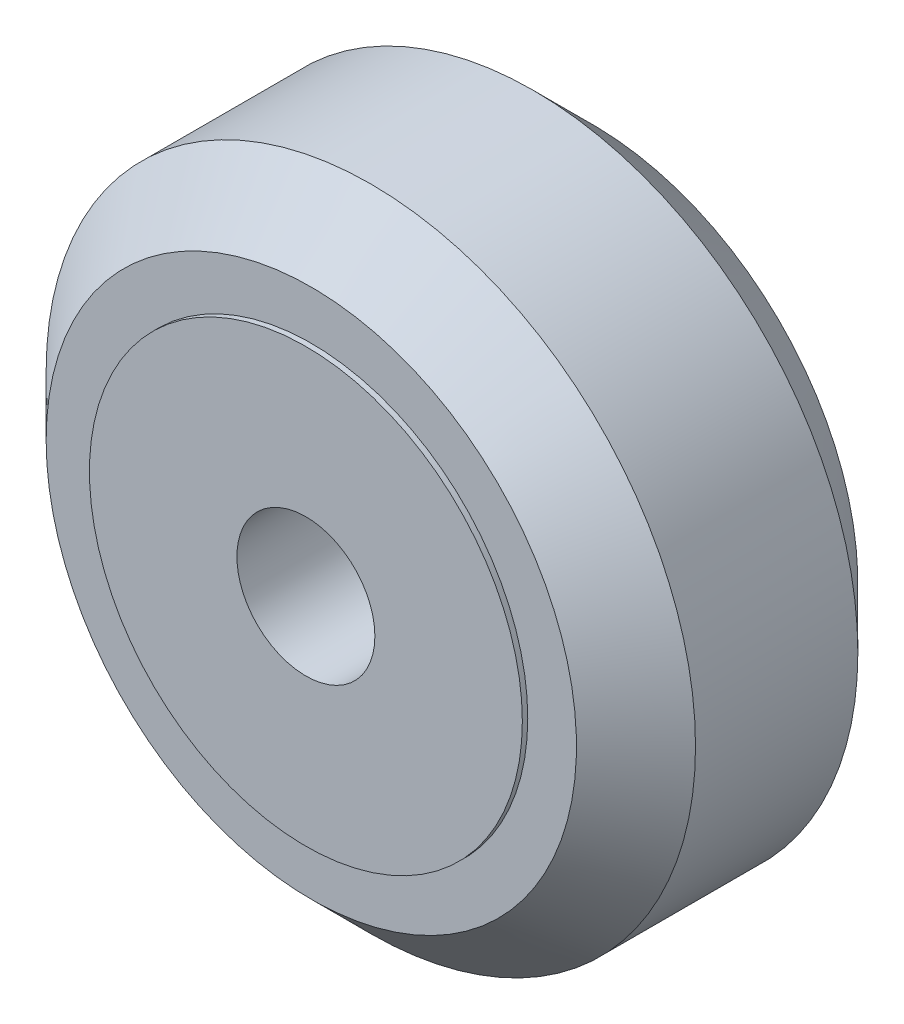
ISO-10303-21;
HEADER;
FILE_DESCRIPTION(('STEP AP214'),'2;1');
FILE_NAME('part.step','',(''),(''),'','','');
FILE_SCHEMA(('AUTOMOTIVE_DESIGN { 1 0 10303 214 1 1 1 1 }'));
ENDSEC;
DATA;
#1=APPLICATION_CONTEXT('core data for automotive mechanical design processes');
#2=APPLICATION_PROTOCOL_DEFINITION('international standard','automotive_design',2000,#1);
#3=PRODUCT_CONTEXT('',#1,'mechanical');
#4=PRODUCT('Part','Part','',(#3));
#5=PRODUCT_RELATED_PRODUCT_CATEGORY('part','',(#4));
#6=PRODUCT_DEFINITION_FORMATION('','',#4);
#7=PRODUCT_DEFINITION_CONTEXT('part definition',#1,'design');
#8=PRODUCT_DEFINITION('design','',#6,#7);
#9=PRODUCT_DEFINITION_SHAPE('','',#8);
#10=(LENGTH_UNIT() NAMED_UNIT(*) SI_UNIT(.MILLI.,.METRE.));
#11=(NAMED_UNIT(*) PLANE_ANGLE_UNIT() SI_UNIT($,.RADIAN.));
#12=(NAMED_UNIT(*) SI_UNIT($,.STERADIAN.) SOLID_ANGLE_UNIT());
#13=UNCERTAINTY_MEASURE_WITH_UNIT(LENGTH_MEASURE(1.E-05),#10,'distance_accuracy_value','');
#14=(GEOMETRIC_REPRESENTATION_CONTEXT(3) GLOBAL_UNCERTAINTY_ASSIGNED_CONTEXT((#13)) GLOBAL_UNIT_ASSIGNED_CONTEXT((#10,
#11,#12)) REPRESENTATION_CONTEXT('',''));
#15=CARTESIAN_POINT('',(0.,0.,0.));
#16=DIRECTION('',(0.,0.,1.));
#17=DIRECTION('',(1.,0.,0.));
#18=AXIS2_PLACEMENT_3D('',#15,#16,#17);
#19=CARTESIAN_POINT('',(0.,8.,11.0451322694377));
#20=DIRECTION('',(0.,0.,1.));
#21=DIRECTION('',(1.,0.,0.));
#22=AXIS2_PLACEMENT_3D('',#19,#20,#21);
#23=PLANE('',#22);
#24=CARTESIAN_POINT('',(0.,0.,11.0451322694377));
#25=DIRECTION('',(0.,0.,-1.));
#26=DIRECTION('',(-1.,0.,0.));
#27=AXIS2_PLACEMENT_3D('',#24,#25,#26);
#28=CIRCLE('',#27,9.80000000000001);
#29=CARTESIAN_POINT('',(-9.80000000000001,0.,11.0451322694377));
#30=VERTEX_POINT('',#29);
#31=EDGE_CURVE('E40',#30,#30,#28,.T.);
#32=ORIENTED_EDGE('',*,*,#31,.F.);
#33=EDGE_LOOP('',(#32));
#34=FACE_BOUND('',#33,.T.);
#35=CARTESIAN_POINT('',(0.,0.,11.0451322694377));
#36=DIRECTION('',(0.,0.,1.));
#37=DIRECTION('',(1.,0.,0.));
#38=AXIS2_PLACEMENT_3D('',#35,#36,#37);
#39=CIRCLE('',#38,8.);
#40=CARTESIAN_POINT('',(8.,0.,11.0451322694377));
#41=VERTEX_POINT('',#40);
#42=EDGE_CURVE('E63',#41,#41,#39,.T.);
#43=ORIENTED_EDGE('',*,*,#42,.F.);
#44=EDGE_LOOP('',(#43));
#45=FACE_BOUND('',#44,.T.);
#46=ADVANCED_FACE('F33',(#34,#45),#23,.T.);
#47=CARTESIAN_POINT('',(0.,9.79999999999999,0.645132269437749));
#48=DIRECTION('',(0.,0.,-1.));
#49=DIRECTION('',(-1.,0.,0.));
#50=AXIS2_PLACEMENT_3D('',#47,#48,#49);
#51=PLANE('',#50);
#52=CARTESIAN_POINT('',(0.,0.,0.645132269437749));
#53=DIRECTION('',(0.,0.,-1.));
#54=DIRECTION('',(-1.,0.,0.));
#55=AXIS2_PLACEMENT_3D('',#52,#53,#54);
#56=CIRCLE('',#55,9.79999999999999);
#57=CARTESIAN_POINT('',(-9.79999999999999,0.,0.645132269437749));
#58=VERTEX_POINT('',#57);
#59=EDGE_CURVE('E53',#58,#58,#56,.T.);
#60=ORIENTED_EDGE('',*,*,#59,.T.);
#61=EDGE_LOOP('',(#60));
#62=FACE_BOUND('',#61,.T.);
#63=CARTESIAN_POINT('',(0.,0.,0.645132269437749));
#64=DIRECTION('',(0.,0.,-1.));
#65=DIRECTION('',(-1.,0.,0.));
#66=AXIS2_PLACEMENT_3D('',#63,#64,#65);
#67=CIRCLE('',#66,8.);
#68=CARTESIAN_POINT('',(-8.,0.,0.645132269437749));
#69=VERTEX_POINT('',#68);
#70=EDGE_CURVE('E10',#69,#69,#67,.T.);
#71=ORIENTED_EDGE('',*,*,#70,.F.);
#72=EDGE_LOOP('',(#71));
#73=FACE_BOUND('',#72,.T.);
#74=ADVANCED_FACE('F35',(#62,#73),#51,.T.);
#75=CARTESIAN_POINT('',(0.,0.,8.84513226943775));
#76=DIRECTION('',(0.,0.,-1.));
#77=DIRECTION('',(-1.,0.,0.));
#78=AXIS2_PLACEMENT_3D('',#75,#76,#77);
#79=CONICAL_SURFACE('',#78,12.,0.785398163397447);
#80=ORIENTED_EDGE('',*,*,#31,.T.);
#81=EDGE_LOOP('',(#80));
#82=FACE_BOUND('',#81,.T.);
#83=CARTESIAN_POINT('',(0.,0.,8.84513226943775));
#84=DIRECTION('',(0.,0.,-1.));
#85=DIRECTION('',(-1.,0.,0.));
#86=AXIS2_PLACEMENT_3D('',#83,#84,#85);
#87=CIRCLE('',#86,12.);
#88=CARTESIAN_POINT('',(-12.,0.,8.84513226943775));
#89=VERTEX_POINT('',#88);
#90=EDGE_CURVE('E44',#89,#89,#87,.T.);
#91=ORIENTED_EDGE('',*,*,#90,.F.);
#92=EDGE_LOOP('',(#91));
#93=FACE_BOUND('',#92,.T.);
#94=ADVANCED_FACE('F93',(#82,#93),#79,.T.);
#95=CARTESIAN_POINT('',(0.,0.,0.));
#96=DIRECTION('',(0.,0.,-1.));
#97=DIRECTION('',(-1.,0.,0.));
#98=AXIS2_PLACEMENT_3D('',#95,#96,#97);
#99=CYLINDRICAL_SURFACE('',#98,12.);
#100=ORIENTED_EDGE('',*,*,#90,.T.);
#101=EDGE_LOOP('',(#100));
#102=FACE_BOUND('',#101,.T.);
#103=CARTESIAN_POINT('',(0.,0.,2.84513226943775));
#104=DIRECTION('',(0.,0.,-1.));
#105=DIRECTION('',(-1.,0.,0.));
#106=AXIS2_PLACEMENT_3D('',#103,#104,#105);
#107=CIRCLE('',#106,12.);
#108=CARTESIAN_POINT('',(-12.,0.,2.84513226943775));
#109=VERTEX_POINT('',#108);
#110=EDGE_CURVE('E48',#109,#109,#107,.T.);
#111=ORIENTED_EDGE('',*,*,#110,.F.);
#112=EDGE_LOOP('',(#111));
#113=FACE_BOUND('',#112,.T.);
#114=ADVANCED_FACE('F99',(#102,#113),#99,.T.);
#115=CARTESIAN_POINT('',(0.,0.,0.645132269437749));
#116=DIRECTION('',(0.,0.,1.));
#117=DIRECTION('',(1.,0.,0.));
#118=AXIS2_PLACEMENT_3D('',#115,#116,#117);
#119=CONICAL_SURFACE('',#118,9.79999999999999,0.78539816339745);
#120=ORIENTED_EDGE('',*,*,#110,.T.);
#121=EDGE_LOOP('',(#120));
#122=FACE_BOUND('',#121,.T.);
#123=ORIENTED_EDGE('',*,*,#59,.F.);
#124=EDGE_LOOP('',(#123));
#125=FACE_BOUND('',#124,.T.);
#126=ADVANCED_FACE('F102',(#122,#125),#119,.T.);
#127=CARTESIAN_POINT('',(0.,0.,0.445132269437749));
#128=DIRECTION('',(0.,0.,1.));
#129=DIRECTION('',(1.,0.,0.));
#130=AXIS2_PLACEMENT_3D('',#127,#128,#129);
#131=CYLINDRICAL_SURFACE('',#130,8.);
#132=ORIENTED_EDGE('',*,*,#70,.T.);
#133=EDGE_LOOP('',(#132));
#134=FACE_BOUND('',#133,.T.);
#135=CARTESIAN_POINT('',(0.,0.,0.445132269437749));
#136=DIRECTION('',(0.,0.,1.));
#137=DIRECTION('',(1.,0.,0.));
#138=AXIS2_PLACEMENT_3D('',#135,#136,#137);
#139=CIRCLE('',#138,8.);
#140=CARTESIAN_POINT('',(8.,0.,0.445132269437749));
#141=VERTEX_POINT('',#140);
#142=EDGE_CURVE('E56',#141,#141,#139,.T.);
#143=ORIENTED_EDGE('',*,*,#142,.T.);
#144=EDGE_LOOP('',(#143));
#145=FACE_BOUND('',#144,.T.);
#146=ADVANCED_FACE('F106',(#134,#145),#131,.T.);
#147=CARTESIAN_POINT('',(0.,0.,0.445132269437749));
#148=DIRECTION('',(0.,0.,1.));
#149=DIRECTION('',(1.,0.,0.));
#150=AXIS2_PLACEMENT_3D('',#147,#148,#149);
#151=PLANE('',#150);
#152=CARTESIAN_POINT('',(0.,0.,0.445132269437749));
#153=DIRECTION('',(0.,0.,1.));
#154=DIRECTION('',(1.,0.,0.));
#155=AXIS2_PLACEMENT_3D('',#152,#153,#154);
#156=CIRCLE('',#155,2.55);
#157=CARTESIAN_POINT('',(2.55,0.,0.445132269437749));
#158=VERTEX_POINT('',#157);
#159=EDGE_CURVE('E59',#158,#158,#156,.T.);
#160=ORIENTED_EDGE('',*,*,#159,.T.);
#161=EDGE_LOOP('',(#160));
#162=FACE_BOUND('',#161,.T.);
#163=ORIENTED_EDGE('',*,*,#142,.F.);
#164=EDGE_LOOP('',(#163));
#165=FACE_BOUND('',#164,.T.);
#166=ADVANCED_FACE('F85',(#162,#165),#151,.F.);
#167=CARTESIAN_POINT('',(0.,0.,0.445132269437749));
#168=DIRECTION('',(0.,0.,1.));
#169=DIRECTION('',(1.,0.,0.));
#170=AXIS2_PLACEMENT_3D('',#167,#168,#169);
#171=CYLINDRICAL_SURFACE('',#170,2.55);
#172=ORIENTED_EDGE('',*,*,#159,.F.);
#173=EDGE_LOOP('',(#172));
#174=FACE_BOUND('',#173,.T.);
#175=CARTESIAN_POINT('',(0.,0.,11.2451322694378));
#176=DIRECTION('',(0.,0.,1.));
#177=DIRECTION('',(1.,0.,0.));
#178=AXIS2_PLACEMENT_3D('',#175,#176,#177);
#179=CIRCLE('',#178,2.55);
#180=CARTESIAN_POINT('',(2.55,0.,11.2451322694378));
#181=VERTEX_POINT('',#180);
#182=EDGE_CURVE('E66',#181,#181,#179,.T.);
#183=ORIENTED_EDGE('',*,*,#182,.T.);
#184=EDGE_LOOP('',(#183));
#185=FACE_BOUND('',#184,.T.);
#186=ADVANCED_FACE('F72',(#174,#185),#171,.F.);
#187=CARTESIAN_POINT('',(0.,0.,11.2451322694378));
#188=DIRECTION('',(0.,0.,1.));
#189=DIRECTION('',(1.,0.,0.));
#190=AXIS2_PLACEMENT_3D('',#187,#188,#189);
#191=PLANE('',#190);
#192=CARTESIAN_POINT('',(0.,0.,11.2451322694378));
#193=DIRECTION('',(0.,0.,1.));
#194=DIRECTION('',(1.,0.,0.));
#195=AXIS2_PLACEMENT_3D('',#192,#193,#194);
#196=CIRCLE('',#195,8.);
#197=CARTESIAN_POINT('',(8.,0.,11.2451322694378));
#198=VERTEX_POINT('',#197);
#199=EDGE_CURVE('E62',#198,#198,#196,.T.);
#200=ORIENTED_EDGE('',*,*,#199,.T.);
#201=EDGE_LOOP('',(#200));
#202=FACE_BOUND('',#201,.T.);
#203=ORIENTED_EDGE('',*,*,#182,.F.);
#204=EDGE_LOOP('',(#203));
#205=FACE_BOUND('',#204,.T.);
#206=ADVANCED_FACE('F74',(#202,#205),#191,.T.);
#207=CARTESIAN_POINT('',(0.,0.,11.2451322694378));
#208=DIRECTION('',(0.,0.,-1.));
#209=DIRECTION('',(-1.,0.,0.));
#210=AXIS2_PLACEMENT_3D('',#207,#208,#209);
#211=CYLINDRICAL_SURFACE('',#210,8.);
#212=ORIENTED_EDGE('',*,*,#199,.F.);
#213=EDGE_LOOP('',(#212));
#214=FACE_BOUND('',#213,.T.);
#215=ORIENTED_EDGE('',*,*,#42,.T.);
#216=EDGE_LOOP('',(#215));
#217=FACE_BOUND('',#216,.T.);
#218=ADVANCED_FACE('F76',(#214,#217),#211,.T.);
#219=CLOSED_SHELL('',(#46,#74,#94,#114,#126,#146,#166,#186,#206,#218));
#220=MANIFOLD_SOLID_BREP('B2',#219);
#221=ADVANCED_BREP_SHAPE_REPRESENTATION('',(#18,#220),#14);
#222=SHAPE_DEFINITION_REPRESENTATION(#9,#221);
ENDSEC;
END-ISO-10303-21;
